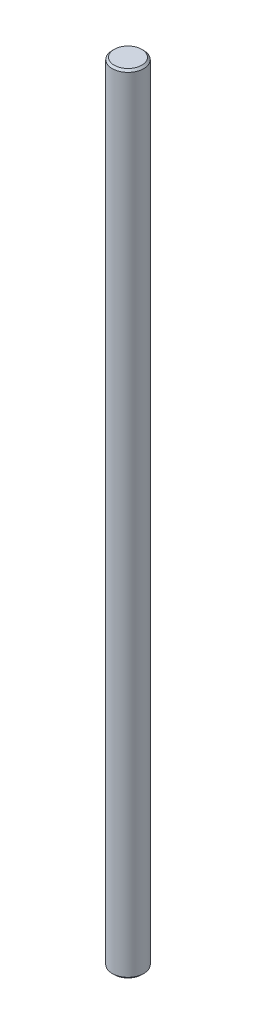
ISO-10303-21;
HEADER;
FILE_DESCRIPTION(('STEP AP214'),'2;1');
FILE_NAME('part.step','',(''),(''),'','','');
FILE_SCHEMA(('AUTOMOTIVE_DESIGN { 1 0 10303 214 1 1 1 1 }'));
ENDSEC;
DATA;
#1=APPLICATION_CONTEXT('core data for automotive mechanical design processes');
#2=APPLICATION_PROTOCOL_DEFINITION('international standard','automotive_design',2000,#1);
#3=PRODUCT_CONTEXT('',#1,'mechanical');
#4=PRODUCT('Part','Part','',(#3));
#5=PRODUCT_RELATED_PRODUCT_CATEGORY('part','',(#4));
#6=PRODUCT_DEFINITION_FORMATION('','',#4);
#7=PRODUCT_DEFINITION_CONTEXT('part definition',#1,'design');
#8=PRODUCT_DEFINITION('design','',#6,#7);
#9=PRODUCT_DEFINITION_SHAPE('','',#8);
#10=(LENGTH_UNIT() NAMED_UNIT(*) SI_UNIT(.MILLI.,.METRE.));
#11=(NAMED_UNIT(*) PLANE_ANGLE_UNIT() SI_UNIT($,.RADIAN.));
#12=(NAMED_UNIT(*) SI_UNIT($,.STERADIAN.) SOLID_ANGLE_UNIT());
#13=UNCERTAINTY_MEASURE_WITH_UNIT(LENGTH_MEASURE(1.E-05),#10,'distance_accuracy_value','');
#14=(GEOMETRIC_REPRESENTATION_CONTEXT(3) GLOBAL_UNCERTAINTY_ASSIGNED_CONTEXT((#13)) GLOBAL_UNIT_ASSIGNED_CONTEXT((#10,
#11,#12)) REPRESENTATION_CONTEXT('',''));
#15=CARTESIAN_POINT('',(0.,0.,0.));
#16=DIRECTION('',(0.,0.,1.));
#17=DIRECTION('',(1.,0.,0.));
#18=AXIS2_PLACEMENT_3D('',#15,#16,#17);
#19=CARTESIAN_POINT('',(0.,200.,0.));
#20=DIRECTION('',(0.,-1.,0.));
#21=DIRECTION('',(0.,0.,-1.));
#22=AXIS2_PLACEMENT_3D('',#19,#20,#21);
#23=CYLINDRICAL_SURFACE('',#22,4.);
#24=CARTESIAN_POINT('',(0.,199.5,0.));
#25=DIRECTION('',(0.,1.,0.));
#26=DIRECTION('',(0.,0.,1.));
#27=AXIS2_PLACEMENT_3D('',#24,#25,#26);
#28=CIRCLE('',#27,4.);
#29=CARTESIAN_POINT('',(0.,199.5,4.));
#30=VERTEX_POINT('',#29);
#31=EDGE_CURVE('E40',#30,#30,#28,.F.);
#32=ORIENTED_EDGE('',*,*,#31,.T.);
#33=EDGE_LOOP('',(#32));
#34=FACE_BOUND('',#33,.T.);
#35=CARTESIAN_POINT('',(0.,0.5,0.));
#36=DIRECTION('',(0.,1.,0.));
#37=DIRECTION('',(0.,0.,1.));
#38=AXIS2_PLACEMENT_3D('',#35,#36,#37);
#39=CIRCLE('',#38,4.);
#40=CARTESIAN_POINT('',(0.,0.5,4.));
#41=VERTEX_POINT('',#40);
#42=EDGE_CURVE('E44',#41,#41,#39,.T.);
#43=ORIENTED_EDGE('',*,*,#42,.T.);
#44=EDGE_LOOP('',(#43));
#45=FACE_BOUND('',#44,.T.);
#46=ADVANCED_FACE('F33',(#34,#45),#23,.T.);
#47=CARTESIAN_POINT('',(0.,200.,0.));
#48=DIRECTION('',(0.,1.,0.));
#49=DIRECTION('',(0.,0.,1.));
#50=AXIS2_PLACEMENT_3D('',#47,#48,#49);
#51=PLANE('',#50);
#52=CARTESIAN_POINT('',(0.,200.,0.));
#53=DIRECTION('',(0.,1.,0.));
#54=DIRECTION('',(0.,0.,1.));
#55=AXIS2_PLACEMENT_3D('',#52,#53,#54);
#56=CIRCLE('',#55,3.5);
#57=CARTESIAN_POINT('',(0.,200.,3.5));
#58=VERTEX_POINT('',#57);
#59=EDGE_CURVE('E48',#58,#58,#56,.T.);
#60=ORIENTED_EDGE('',*,*,#59,.T.);
#61=EDGE_LOOP('',(#60));
#62=FACE_BOUND('',#61,.T.);
#63=ADVANCED_FACE('F54',(#62),#51,.T.);
#64=CARTESIAN_POINT('',(0.,0.,0.));
#65=DIRECTION('',(0.,1.,0.));
#66=DIRECTION('',(0.,0.,1.));
#67=AXIS2_PLACEMENT_3D('',#64,#65,#66);
#68=PLANE('',#67);
#69=CARTESIAN_POINT('',(0.,0.,0.));
#70=DIRECTION('',(0.,1.,0.));
#71=DIRECTION('',(0.,0.,1.));
#72=AXIS2_PLACEMENT_3D('',#69,#70,#71);
#73=CIRCLE('',#72,3.49999999999998);
#74=CARTESIAN_POINT('',(0.,0.,3.49999999999998));
#75=VERTEX_POINT('',#74);
#76=EDGE_CURVE('E10',#75,#75,#73,.F.);
#77=ORIENTED_EDGE('',*,*,#76,.T.);
#78=EDGE_LOOP('',(#77));
#79=FACE_BOUND('',#78,.T.);
#80=ADVANCED_FACE('F58',(#79),#68,.F.);
#81=CARTESIAN_POINT('',(0.,200.,0.));
#82=DIRECTION('',(0.,-1.,0.));
#83=DIRECTION('',(0.,0.,-1.));
#84=AXIS2_PLACEMENT_3D('',#81,#82,#83);
#85=CONICAL_SURFACE('',#84,3.5,0.785398163397473);
#86=ORIENTED_EDGE('',*,*,#31,.F.);
#87=EDGE_LOOP('',(#86));
#88=FACE_BOUND('',#87,.T.);
#89=ORIENTED_EDGE('',*,*,#59,.F.);
#90=EDGE_LOOP('',(#89));
#91=FACE_BOUND('',#90,.T.);
#92=ADVANCED_FACE('F56',(#88,#91),#85,.T.);
#93=CARTESIAN_POINT('',(0.,0.5,0.));
#94=DIRECTION('',(0.,1.,0.));
#95=DIRECTION('',(0.,0.,1.));
#96=AXIS2_PLACEMENT_3D('',#93,#94,#95);
#97=CONICAL_SURFACE('',#96,4.,0.785398163397473);
#98=ORIENTED_EDGE('',*,*,#76,.F.);
#99=EDGE_LOOP('',(#98));
#100=FACE_BOUND('',#99,.T.);
#101=ORIENTED_EDGE('',*,*,#42,.F.);
#102=EDGE_LOOP('',(#101));
#103=FACE_BOUND('',#102,.T.);
#104=ADVANCED_FACE('F35',(#100,#103),#97,.T.);
#105=CLOSED_SHELL('',(#46,#63,#80,#92,#104));
#106=MANIFOLD_SOLID_BREP('B2',#105);
#107=ADVANCED_BREP_SHAPE_REPRESENTATION('',(#18,#106),#14);
#108=SHAPE_DEFINITION_REPRESENTATION(#9,#107);
ENDSEC;
END-ISO-10303-21;
